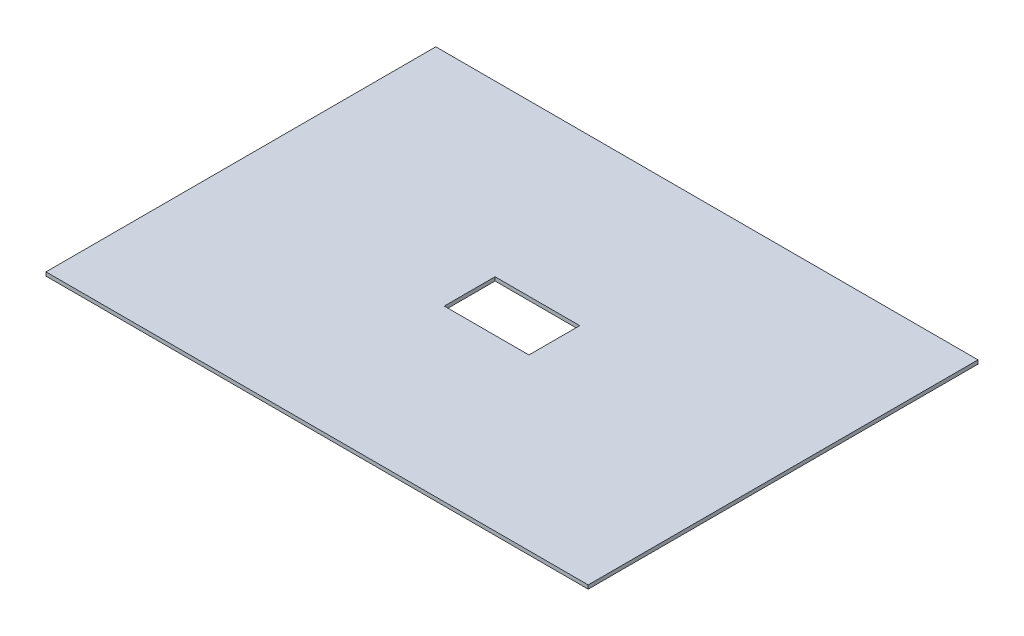
ISO-10303-21;
HEADER;
FILE_DESCRIPTION(('STEP AP214'),'2;1');
FILE_NAME('part.step','',(''),(''),'','','');
FILE_SCHEMA(('AUTOMOTIVE_DESIGN { 1 0 10303 214 1 1 1 1 }'));
ENDSEC;
DATA;
#1=APPLICATION_CONTEXT('core data for automotive mechanical design processes');
#2=APPLICATION_PROTOCOL_DEFINITION('international standard','automotive_design',2000,#1);
#3=PRODUCT_CONTEXT('',#1,'mechanical');
#4=PRODUCT('Part','Part','',(#3));
#5=PRODUCT_RELATED_PRODUCT_CATEGORY('part','',(#4));
#6=PRODUCT_DEFINITION_FORMATION('','',#4);
#7=PRODUCT_DEFINITION_CONTEXT('part definition',#1,'design');
#8=PRODUCT_DEFINITION('design','',#6,#7);
#9=PRODUCT_DEFINITION_SHAPE('','',#8);
#10=(LENGTH_UNIT() NAMED_UNIT(*) SI_UNIT(.MILLI.,.METRE.));
#11=(NAMED_UNIT(*) PLANE_ANGLE_UNIT() SI_UNIT($,.RADIAN.));
#12=(NAMED_UNIT(*) SI_UNIT($,.STERADIAN.) SOLID_ANGLE_UNIT());
#13=UNCERTAINTY_MEASURE_WITH_UNIT(LENGTH_MEASURE(1.E-05),#10,'distance_accuracy_value','');
#14=(GEOMETRIC_REPRESENTATION_CONTEXT(3) GLOBAL_UNCERTAINTY_ASSIGNED_CONTEXT((#13)) GLOBAL_UNIT_ASSIGNED_CONTEXT((#10,
#11,#12)) REPRESENTATION_CONTEXT('',''));
#15=CARTESIAN_POINT('',(0.,0.,0.));
#16=DIRECTION('',(0.,0.,1.));
#17=DIRECTION('',(1.,0.,0.));
#18=AXIS2_PLACEMENT_3D('',#15,#16,#17);
#19=CARTESIAN_POINT('',(0.,2.2,0.));
#20=DIRECTION('',(1.,0.,0.));
#21=DIRECTION('',(0.,0.,-1.));
#22=AXIS2_PLACEMENT_3D('',#19,#20,#21);
#23=PLANE('',#22);
#24=DIRECTION('',(0.,0.,1.));
#25=VECTOR('',#24,1.);
#26=CARTESIAN_POINT('',(0.,0.,0.));
#27=LINE('',#26,#25);
#28=CARTESIAN_POINT('',(0.,0.,0.));
#29=VERTEX_POINT('',#28);
#30=CARTESIAN_POINT('',(0.,0.,230.2));
#31=VERTEX_POINT('',#30);
#32=EDGE_CURVE('E135',#29,#31,#27,.T.);
#33=ORIENTED_EDGE('',*,*,#32,.T.);
#34=DIRECTION('',(0.,-1.,0.));
#35=VECTOR('',#34,1.);
#36=CARTESIAN_POINT('',(0.,2.2,230.2));
#37=LINE('',#36,#35);
#38=CARTESIAN_POINT('',(0.,2.2,230.2));
#39=VERTEX_POINT('',#38);
#40=EDGE_CURVE('E11',#39,#31,#37,.T.);
#41=ORIENTED_EDGE('',*,*,#40,.F.);
#42=DIRECTION('',(0.,0.,1.));
#43=VECTOR('',#42,1.);
#44=CARTESIAN_POINT('',(0.,2.2,0.));
#45=LINE('',#44,#43);
#46=CARTESIAN_POINT('',(0.,2.2,0.));
#47=VERTEX_POINT('',#46);
#48=EDGE_CURVE('E139',#47,#39,#45,.T.);
#49=ORIENTED_EDGE('',*,*,#48,.F.);
#50=DIRECTION('',(0.,-1.,0.));
#51=VECTOR('',#50,1.);
#52=CARTESIAN_POINT('',(0.,2.2,0.));
#53=LINE('',#52,#51);
#54=EDGE_CURVE('E149',#47,#29,#53,.T.);
#55=ORIENTED_EDGE('',*,*,#54,.T.);
#56=EDGE_LOOP('',(#33,#41,#49,#55));
#57=FACE_BOUND('',#56,.T.);
#58=ADVANCED_FACE('F38',(#57),#23,.F.);
#59=CARTESIAN_POINT('',(0.,2.2,230.2));
#60=DIRECTION('',(0.,0.,-1.));
#61=DIRECTION('',(-1.,0.,0.));
#62=AXIS2_PLACEMENT_3D('',#59,#60,#61);
#63=PLANE('',#62);
#64=DIRECTION('',(1.,0.,0.));
#65=VECTOR('',#64,1.);
#66=CARTESIAN_POINT('',(0.,0.,230.2));
#67=LINE('',#66,#65);
#68=CARTESIAN_POINT('',(320.2,0.,230.2));
#69=VERTEX_POINT('',#68);
#70=EDGE_CURVE('E152',#31,#69,#67,.T.);
#71=ORIENTED_EDGE('',*,*,#70,.T.);
#72=DIRECTION('',(0.,-1.,0.));
#73=VECTOR('',#72,1.);
#74=CARTESIAN_POINT('',(320.2,2.2,230.2));
#75=LINE('',#74,#73);
#76=CARTESIAN_POINT('',(320.2,2.2,230.2));
#77=VERTEX_POINT('',#76);
#78=EDGE_CURVE('E45',#77,#69,#75,.T.);
#79=ORIENTED_EDGE('',*,*,#78,.F.);
#80=DIRECTION('',(1.,0.,0.));
#81=VECTOR('',#80,1.);
#82=CARTESIAN_POINT('',(0.,2.2,230.2));
#83=LINE('',#82,#81);
#84=EDGE_CURVE('E142',#39,#77,#83,.T.);
#85=ORIENTED_EDGE('',*,*,#84,.F.);
#86=ORIENTED_EDGE('',*,*,#40,.T.);
#87=EDGE_LOOP('',(#71,#79,#85,#86));
#88=FACE_BOUND('',#87,.T.);
#89=ADVANCED_FACE('F180',(#88),#63,.F.);
#90=CARTESIAN_POINT('',(320.2,2.2,0.));
#91=DIRECTION('',(-1.,0.,0.));
#92=DIRECTION('',(0.,0.,1.));
#93=AXIS2_PLACEMENT_3D('',#90,#91,#92);
#94=PLANE('',#93);
#95=DIRECTION('',(0.,0.,-1.));
#96=VECTOR('',#95,1.);
#97=CARTESIAN_POINT('',(320.2,0.,0.));
#98=LINE('',#97,#96);
#99=CARTESIAN_POINT('',(320.2,0.,0.));
#100=VERTEX_POINT('',#99);
#101=EDGE_CURVE('E154',#69,#100,#98,.T.);
#102=ORIENTED_EDGE('',*,*,#101,.T.);
#103=DIRECTION('',(0.,-1.,0.));
#104=VECTOR('',#103,1.);
#105=CARTESIAN_POINT('',(320.2,2.2,0.));
#106=LINE('',#105,#104);
#107=CARTESIAN_POINT('',(320.2,2.2,0.));
#108=VERTEX_POINT('',#107);
#109=EDGE_CURVE('E159',#108,#100,#106,.T.);
#110=ORIENTED_EDGE('',*,*,#109,.F.);
#111=DIRECTION('',(0.,0.,-1.));
#112=VECTOR('',#111,1.);
#113=CARTESIAN_POINT('',(320.2,2.2,0.));
#114=LINE('',#113,#112);
#115=EDGE_CURVE('E145',#77,#108,#114,.T.);
#116=ORIENTED_EDGE('',*,*,#115,.F.);
#117=ORIENTED_EDGE('',*,*,#78,.T.);
#118=EDGE_LOOP('',(#102,#110,#116,#117));
#119=FACE_BOUND('',#118,.T.);
#120=ADVANCED_FACE('F166',(#119),#94,.F.);
#121=CARTESIAN_POINT('',(0.,2.2,0.));
#122=DIRECTION('',(0.,0.,1.));
#123=DIRECTION('',(1.,0.,0.));
#124=AXIS2_PLACEMENT_3D('',#121,#122,#123);
#125=PLANE('',#124);
#126=DIRECTION('',(-1.,0.,0.));
#127=VECTOR('',#126,1.);
#128=CARTESIAN_POINT('',(0.,0.,0.));
#129=LINE('',#128,#127);
#130=EDGE_CURVE('E143',#100,#29,#129,.T.);
#131=ORIENTED_EDGE('',*,*,#130,.T.);
#132=ORIENTED_EDGE('',*,*,#54,.F.);
#133=DIRECTION('',(-1.,0.,0.));
#134=VECTOR('',#133,1.);
#135=CARTESIAN_POINT('',(0.,2.2,0.));
#136=LINE('',#135,#134);
#137=EDGE_CURVE('E147',#108,#47,#136,.T.);
#138=ORIENTED_EDGE('',*,*,#137,.F.);
#139=ORIENTED_EDGE('',*,*,#109,.T.);
#140=EDGE_LOOP('',(#131,#132,#138,#139));
#141=FACE_BOUND('',#140,.T.);
#142=ADVANCED_FACE('F173',(#141),#125,.F.);
#143=CARTESIAN_POINT('',(0.,2.2,0.));
#144=DIRECTION('',(0.,1.,0.));
#145=DIRECTION('',(0.,0.,1.));
#146=AXIS2_PLACEMENT_3D('',#143,#144,#145);
#147=PLANE('',#146);
#148=DIRECTION('',(0.,0.,1.));
#149=VECTOR('',#148,1.);
#150=CARTESIAN_POINT('',(135.1,2.2,100.1));
#151=LINE('',#150,#149);
#152=CARTESIAN_POINT('',(135.1,2.2,100.1));
#153=VERTEX_POINT('',#152);
#154=CARTESIAN_POINT('',(135.1,2.2,130.1));
#155=VERTEX_POINT('',#154);
#156=EDGE_CURVE('E52',#153,#155,#151,.T.);
#157=ORIENTED_EDGE('',*,*,#156,.F.);
#158=DIRECTION('',(-1.,0.,0.));
#159=VECTOR('',#158,1.);
#160=CARTESIAN_POINT('',(135.1,2.2,100.1));
#161=LINE('',#160,#159);
#162=CARTESIAN_POINT('',(185.1,2.2,100.1));
#163=VERTEX_POINT('',#162);
#164=EDGE_CURVE('E120',#163,#153,#161,.T.);
#165=ORIENTED_EDGE('',*,*,#164,.F.);
#166=DIRECTION('',(0.,0.,-1.));
#167=VECTOR('',#166,1.);
#168=CARTESIAN_POINT('',(185.1,2.2,100.1));
#169=LINE('',#168,#167);
#170=CARTESIAN_POINT('',(185.1,2.2,130.1));
#171=VERTEX_POINT('',#170);
#172=EDGE_CURVE('E123',#171,#163,#169,.T.);
#173=ORIENTED_EDGE('',*,*,#172,.F.);
#174=DIRECTION('',(1.,0.,0.));
#175=VECTOR('',#174,1.);
#176=CARTESIAN_POINT('',(135.1,2.2,130.1));
#177=LINE('',#176,#175);
#178=EDGE_CURVE('E129',#155,#171,#177,.T.);
#179=ORIENTED_EDGE('',*,*,#178,.F.);
#180=EDGE_LOOP('',(#157,#165,#173,#179));
#181=FACE_BOUND('',#180,.T.);
#182=ORIENTED_EDGE('',*,*,#48,.T.);
#183=ORIENTED_EDGE('',*,*,#84,.T.);
#184=ORIENTED_EDGE('',*,*,#115,.T.);
#185=ORIENTED_EDGE('',*,*,#137,.T.);
#186=EDGE_LOOP('',(#182,#183,#184,#185));
#187=FACE_BOUND('',#186,.T.);
#188=ADVANCED_FACE('F179',(#181,#187),#147,.T.);
#189=CARTESIAN_POINT('',(0.,0.,0.));
#190=DIRECTION('',(0.,1.,0.));
#191=DIRECTION('',(0.,0.,1.));
#192=AXIS2_PLACEMENT_3D('',#189,#190,#191);
#193=PLANE('',#192);
#194=DIRECTION('',(-1.,0.,0.));
#195=VECTOR('',#194,1.);
#196=CARTESIAN_POINT('',(135.1,0.,100.1));
#197=LINE('',#196,#195);
#198=CARTESIAN_POINT('',(185.1,0.,100.1));
#199=VERTEX_POINT('',#198);
#200=CARTESIAN_POINT('',(135.1,0.,100.1));
#201=VERTEX_POINT('',#200);
#202=EDGE_CURVE('E110',#199,#201,#197,.T.);
#203=ORIENTED_EDGE('',*,*,#202,.T.);
#204=DIRECTION('',(0.,0.,1.));
#205=VECTOR('',#204,1.);
#206=CARTESIAN_POINT('',(135.1,0.,100.1));
#207=LINE('',#206,#205);
#208=CARTESIAN_POINT('',(135.1,0.,130.1));
#209=VERTEX_POINT('',#208);
#210=EDGE_CURVE('E104',#201,#209,#207,.T.);
#211=ORIENTED_EDGE('',*,*,#210,.T.);
#212=DIRECTION('',(1.,0.,0.));
#213=VECTOR('',#212,1.);
#214=CARTESIAN_POINT('',(135.1,0.,130.1));
#215=LINE('',#214,#213);
#216=CARTESIAN_POINT('',(185.1,0.,130.1));
#217=VERTEX_POINT('',#216);
#218=EDGE_CURVE('E113',#209,#217,#215,.T.);
#219=ORIENTED_EDGE('',*,*,#218,.T.);
#220=DIRECTION('',(0.,0.,-1.));
#221=VECTOR('',#220,1.);
#222=CARTESIAN_POINT('',(185.1,0.,100.1));
#223=LINE('',#222,#221);
#224=EDGE_CURVE('E60',#217,#199,#223,.T.);
#225=ORIENTED_EDGE('',*,*,#224,.T.);
#226=EDGE_LOOP('',(#203,#211,#219,#225));
#227=FACE_BOUND('',#226,.T.);
#228=ORIENTED_EDGE('',*,*,#32,.F.);
#229=ORIENTED_EDGE('',*,*,#130,.F.);
#230=ORIENTED_EDGE('',*,*,#101,.F.);
#231=ORIENTED_EDGE('',*,*,#70,.F.);
#232=EDGE_LOOP('',(#228,#229,#230,#231));
#233=FACE_BOUND('',#232,.T.);
#234=ADVANCED_FACE('F117',(#227,#233),#193,.F.);
#235=CARTESIAN_POINT('',(135.1,0.,100.1));
#236=DIRECTION('',(-1.,0.,0.));
#237=DIRECTION('',(0.,0.,1.));
#238=AXIS2_PLACEMENT_3D('',#235,#236,#237);
#239=PLANE('',#238);
#240=ORIENTED_EDGE('',*,*,#156,.T.);
#241=DIRECTION('',(0.,1.,0.));
#242=VECTOR('',#241,1.);
#243=CARTESIAN_POINT('',(135.1,0.,130.1));
#244=LINE('',#243,#242);
#245=EDGE_CURVE('E100',#209,#155,#244,.T.);
#246=ORIENTED_EDGE('',*,*,#245,.F.);
#247=ORIENTED_EDGE('',*,*,#210,.F.);
#248=DIRECTION('',(0.,1.,0.));
#249=VECTOR('',#248,1.);
#250=CARTESIAN_POINT('',(135.1,0.,100.1));
#251=LINE('',#250,#249);
#252=EDGE_CURVE('E133',#201,#153,#251,.T.);
#253=ORIENTED_EDGE('',*,*,#252,.T.);
#254=EDGE_LOOP('',(#240,#246,#247,#253));
#255=FACE_BOUND('',#254,.T.);
#256=ADVANCED_FACE('F102',(#255),#239,.F.);
#257=CARTESIAN_POINT('',(135.1,0.,100.1));
#258=DIRECTION('',(0.,0.,-1.));
#259=DIRECTION('',(-1.,0.,0.));
#260=AXIS2_PLACEMENT_3D('',#257,#258,#259);
#261=PLANE('',#260);
#262=ORIENTED_EDGE('',*,*,#164,.T.);
#263=ORIENTED_EDGE('',*,*,#252,.F.);
#264=ORIENTED_EDGE('',*,*,#202,.F.);
#265=DIRECTION('',(0.,1.,0.));
#266=VECTOR('',#265,1.);
#267=CARTESIAN_POINT('',(185.1,0.,100.1));
#268=LINE('',#267,#266);
#269=EDGE_CURVE('E136',#199,#163,#268,.T.);
#270=ORIENTED_EDGE('',*,*,#269,.T.);
#271=EDGE_LOOP('',(#262,#263,#264,#270));
#272=FACE_BOUND('',#271,.T.);
#273=ADVANCED_FACE('F197',(#272),#261,.F.);
#274=CARTESIAN_POINT('',(185.1,0.,100.1));
#275=DIRECTION('',(1.,0.,0.));
#276=DIRECTION('',(0.,0.,-1.));
#277=AXIS2_PLACEMENT_3D('',#274,#275,#276);
#278=PLANE('',#277);
#279=ORIENTED_EDGE('',*,*,#172,.T.);
#280=ORIENTED_EDGE('',*,*,#269,.F.);
#281=ORIENTED_EDGE('',*,*,#224,.F.);
#282=DIRECTION('',(0.,1.,0.));
#283=VECTOR('',#282,1.);
#284=CARTESIAN_POINT('',(185.1,0.,130.1));
#285=LINE('',#284,#283);
#286=EDGE_CURVE('E109',#217,#171,#285,.T.);
#287=ORIENTED_EDGE('',*,*,#286,.T.);
#288=EDGE_LOOP('',(#279,#280,#281,#287));
#289=FACE_BOUND('',#288,.T.);
#290=ADVANCED_FACE('F200',(#289),#278,.F.);
#291=CARTESIAN_POINT('',(135.1,0.,130.1));
#292=DIRECTION('',(0.,0.,1.));
#293=DIRECTION('',(1.,0.,0.));
#294=AXIS2_PLACEMENT_3D('',#291,#292,#293);
#295=PLANE('',#294);
#296=ORIENTED_EDGE('',*,*,#178,.T.);
#297=ORIENTED_EDGE('',*,*,#286,.F.);
#298=ORIENTED_EDGE('',*,*,#218,.F.);
#299=ORIENTED_EDGE('',*,*,#245,.T.);
#300=EDGE_LOOP('',(#296,#297,#298,#299));
#301=FACE_BOUND('',#300,.T.);
#302=ADVANCED_FACE('F114',(#301),#295,.F.);
#303=CLOSED_SHELL('',(#58,#89,#120,#142,#188,#234,#256,#273,#290,#302));
#304=MANIFOLD_SOLID_BREP('B2',#303);
#305=ADVANCED_BREP_SHAPE_REPRESENTATION('',(#18,#304),#14);
#306=SHAPE_DEFINITION_REPRESENTATION(#9,#305);
ENDSEC;
END-ISO-10303-21;
